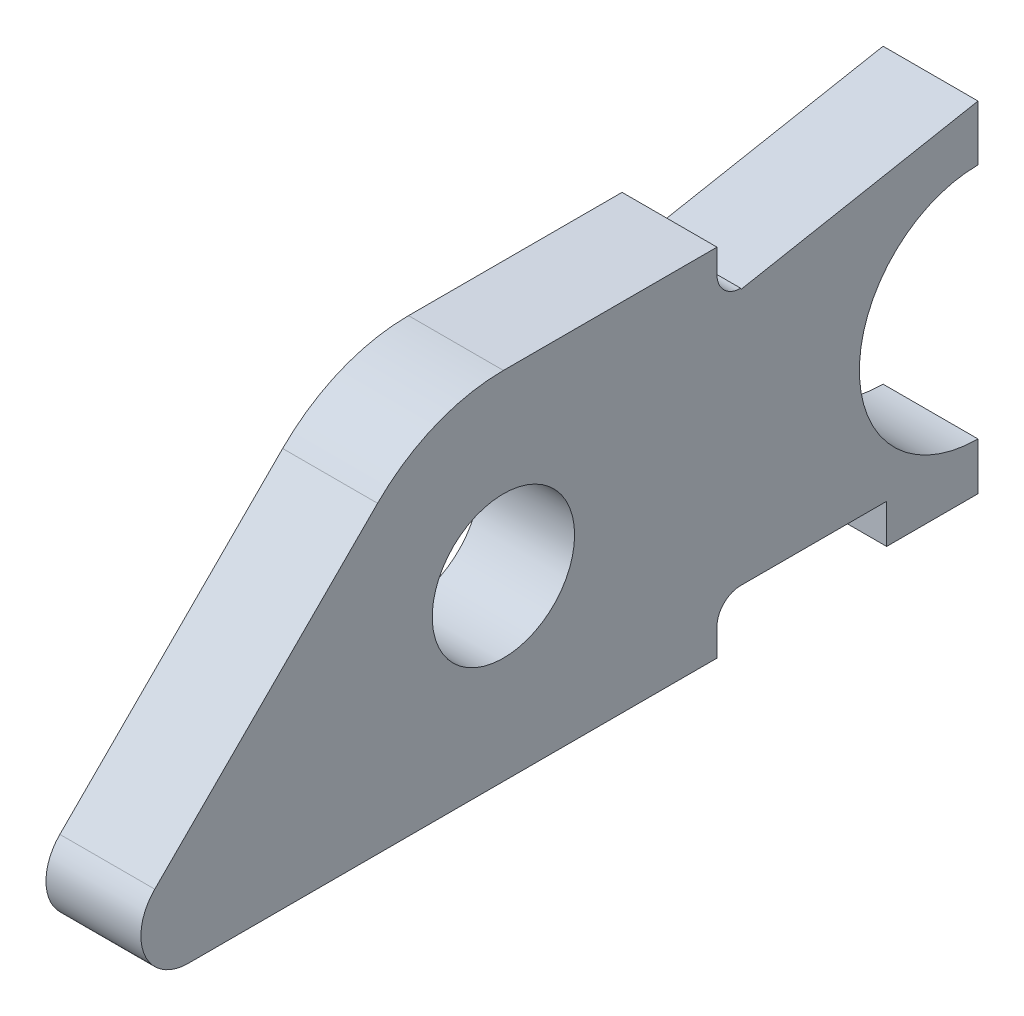
ISO-10303-21;
HEADER;
FILE_DESCRIPTION(('STEP AP214'),'2;1');
FILE_NAME('part.step','',(''),(''),'','','');
FILE_SCHEMA(('AUTOMOTIVE_DESIGN { 1 0 10303 214 1 1 1 1 }'));
ENDSEC;
DATA;
#1=APPLICATION_CONTEXT('core data for automotive mechanical design processes');
#2=APPLICATION_PROTOCOL_DEFINITION('international standard','automotive_design',2000,#1);
#3=PRODUCT_CONTEXT('',#1,'mechanical');
#4=PRODUCT('Part','Part','',(#3));
#5=PRODUCT_RELATED_PRODUCT_CATEGORY('part','',(#4));
#6=PRODUCT_DEFINITION_FORMATION('','',#4);
#7=PRODUCT_DEFINITION_CONTEXT('part definition',#1,'design');
#8=PRODUCT_DEFINITION('design','',#6,#7);
#9=PRODUCT_DEFINITION_SHAPE('','',#8);
#10=(LENGTH_UNIT() NAMED_UNIT(*) SI_UNIT(.MILLI.,.METRE.));
#11=(NAMED_UNIT(*) PLANE_ANGLE_UNIT() SI_UNIT($,.RADIAN.));
#12=(NAMED_UNIT(*) SI_UNIT($,.STERADIAN.) SOLID_ANGLE_UNIT());
#13=UNCERTAINTY_MEASURE_WITH_UNIT(LENGTH_MEASURE(1.E-05),#10,'distance_accuracy_value','');
#14=(GEOMETRIC_REPRESENTATION_CONTEXT(3) GLOBAL_UNCERTAINTY_ASSIGNED_CONTEXT((#13)) GLOBAL_UNIT_ASSIGNED_CONTEXT((#10,
#11,#12)) REPRESENTATION_CONTEXT('',''));
#15=CARTESIAN_POINT('',(0.,0.,0.));
#16=DIRECTION('',(0.,0.,1.));
#17=DIRECTION('',(1.,0.,0.));
#18=AXIS2_PLACEMENT_3D('',#15,#16,#17);
#19=CARTESIAN_POINT('',(-32.4999999999999,4.1,199.425235860835));
#20=DIRECTION('',(0.,0.,-1.));
#21=DIRECTION('',(-1.,0.,0.));
#22=AXIS2_PLACEMENT_3D('',#19,#20,#21);
#23=PLANE('',#22);
#24=DIRECTION('',(-1.,0.,0.));
#25=VECTOR('',#24,1.);
#26=CARTESIAN_POINT('',(-32.4999999999999,1.,199.425235860835));
#27=LINE('',#26,#25);
#28=CARTESIAN_POINT('',(-24.4999999999999,0.999999999999999,199.425235860835));
#29=VERTEX_POINT('',#28);
#30=CARTESIAN_POINT('',(-32.4999999999999,1.,199.425235860835));
#31=VERTEX_POINT('',#30);
#32=EDGE_CURVE('E156',#29,#31,#27,.T.);
#33=ORIENTED_EDGE('',*,*,#32,.F.);
#34=DIRECTION('',(0.,-1.,0.));
#35=VECTOR('',#34,1.);
#36=CARTESIAN_POINT('',(-24.4999999999999,4.1,199.425235860835));
#37=LINE('',#36,#35);
#38=CARTESIAN_POINT('',(-24.4999999999999,4.3,199.425235860835));
#39=VERTEX_POINT('',#38);
#40=EDGE_CURVE('E164',#39,#29,#37,.T.);
#41=ORIENTED_EDGE('',*,*,#40,.F.);
#42=DIRECTION('',(-1.,0.,0.));
#43=VECTOR('',#42,1.);
#44=CARTESIAN_POINT('',(-24.4999999999999,4.3,199.425235860835));
#45=LINE('',#44,#43);
#46=CARTESIAN_POINT('',(-32.4999999999999,4.3,199.425235860835));
#47=VERTEX_POINT('',#46);
#48=EDGE_CURVE('E315',#39,#47,#45,.T.);
#49=ORIENTED_EDGE('',*,*,#48,.T.);
#50=DIRECTION('',(0.,-1.,0.));
#51=VECTOR('',#50,1.);
#52=CARTESIAN_POINT('',(-32.4999999999999,4.1,199.425235860835));
#53=LINE('',#52,#51);
#54=EDGE_CURVE('E166',#47,#31,#53,.T.);
#55=ORIENTED_EDGE('',*,*,#54,.T.);
#56=EDGE_LOOP('',(#33,#41,#49,#55));
#57=FACE_BOUND('',#56,.T.);
#58=ADVANCED_FACE('F33',(#57),#23,.F.);
#59=CARTESIAN_POINT('',(-24.4999999999999,0.,191.725235860835));
#60=DIRECTION('',(0.,0.,1.));
#61=DIRECTION('',(1.,0.,0.));
#62=AXIS2_PLACEMENT_3D('',#59,#60,#61);
#63=PLANE('',#62);
#64=DIRECTION('',(1.,0.,0.));
#65=VECTOR('',#64,1.);
#66=CARTESIAN_POINT('',(-24.4999999999999,1.,191.725235860835));
#67=LINE('',#66,#65);
#68=CARTESIAN_POINT('',(-32.4999999999999,1.,191.725235860835));
#69=VERTEX_POINT('',#68);
#70=CARTESIAN_POINT('',(-24.4999999999999,0.999999999999999,191.725235860835));
#71=VERTEX_POINT('',#70);
#72=EDGE_CURVE('E48',#69,#71,#67,.T.);
#73=ORIENTED_EDGE('',*,*,#72,.F.);
#74=DIRECTION('',(0.,1.,0.));
#75=VECTOR('',#74,1.);
#76=CARTESIAN_POINT('',(-32.4999999999999,0.,191.725235860835));
#77=LINE('',#76,#75);
#78=CARTESIAN_POINT('',(-32.4999999999999,4.99999999999998,191.725235860835));
#79=VERTEX_POINT('',#78);
#80=EDGE_CURVE('E187',#69,#79,#77,.T.);
#81=ORIENTED_EDGE('',*,*,#80,.T.);
#82=DIRECTION('',(-1.,0.,0.));
#83=VECTOR('',#82,1.);
#84=CARTESIAN_POINT('',(-24.4999999999999,4.99999999999998,191.725235860835));
#85=LINE('',#84,#83);
#86=CARTESIAN_POINT('',(-24.4999999999999,4.99999999999998,191.725235860835));
#87=VERTEX_POINT('',#86);
#88=EDGE_CURVE('E235',#87,#79,#85,.T.);
#89=ORIENTED_EDGE('',*,*,#88,.F.);
#90=DIRECTION('',(0.,1.,0.));
#91=VECTOR('',#90,1.);
#92=CARTESIAN_POINT('',(-24.4999999999999,0.,191.725235860835));
#93=LINE('',#92,#91);
#94=EDGE_CURVE('E174',#71,#87,#93,.T.);
#95=ORIENTED_EDGE('',*,*,#94,.F.);
#96=EDGE_LOOP('',(#73,#81,#89,#95));
#97=FACE_BOUND('',#96,.T.);
#98=ADVANCED_FACE('F336',(#97),#63,.F.);
#99=CARTESIAN_POINT('',(-32.4999999999999,15.,231.725235860835));
#100=DIRECTION('',(1.,0.,0.));
#101=DIRECTION('',(0.,0.,-1.));
#102=AXIS2_PLACEMENT_3D('',#99,#100,#101);
#103=PLANE('',#102);
#104=CARTESIAN_POINT('',(-32.4999999999999,15.,231.725235860835));
#105=DIRECTION('',(1.,0.,0.));
#106=DIRECTION('',(0.,0.,-1.));
#107=AXIS2_PLACEMENT_3D('',#104,#105,#106);
#108=CIRCLE('',#107,5.99999999999999);
#109=CARTESIAN_POINT('',(-32.4999999999999,15.,225.725235860835));
#110=VERTEX_POINT('',#109);
#111=EDGE_CURVE('E202',#110,#110,#108,.T.);
#112=ORIENTED_EDGE('',*,*,#111,.T.);
#113=EDGE_LOOP('',(#112));
#114=FACE_BOUND('',#113,.T.);
#115=DIRECTION('',(0.,0.,-1.));
#116=VECTOR('',#115,1.);
#117=CARTESIAN_POINT('',(-32.4999999999999,0.999999999999999,231.725235860835));
#118=LINE('',#117,#116);
#119=EDGE_CURVE('E167',#31,#69,#118,.T.);
#120=ORIENTED_EDGE('',*,*,#119,.F.);
#121=ORIENTED_EDGE('',*,*,#54,.F.);
#122=DIRECTION('',(0.,0.,-1.));
#123=VECTOR('',#122,1.);
#124=CARTESIAN_POINT('',(-32.4999999999999,4.3,211.725235860835));
#125=LINE('',#124,#123);
#126=CARTESIAN_POINT('',(-32.4999999999999,4.3,211.725235860835));
#127=VERTEX_POINT('',#126);
#128=EDGE_CURVE('E325',#127,#47,#125,.T.);
#129=ORIENTED_EDGE('',*,*,#128,.F.);
#130=CARTESIAN_POINT('',(-32.4999999999999,2.3,211.725235860835));
#131=DIRECTION('',(-1.,0.,0.));
#132=DIRECTION('',(0.,0.,-1.));
#133=AXIS2_PLACEMENT_3D('',#130,#131,#132);
#134=CIRCLE('',#133,2.00000000000002);
#135=CARTESIAN_POINT('',(-32.4999999999999,2.3,213.725235860835));
#136=VERTEX_POINT('',#135);
#137=EDGE_CURVE('E55',#136,#127,#134,.T.);
#138=ORIENTED_EDGE('',*,*,#137,.F.);
#139=DIRECTION('',(0.,1.,0.));
#140=VECTOR('',#139,1.);
#141=CARTESIAN_POINT('',(-32.4999999999999,0.,213.725235860835));
#142=LINE('',#141,#140);
#143=CARTESIAN_POINT('',(-32.4999999999999,0.,213.725235860835));
#144=VERTEX_POINT('',#143);
#145=EDGE_CURVE('E321',#144,#136,#142,.T.);
#146=ORIENTED_EDGE('',*,*,#145,.F.);
#147=DIRECTION('',(0.,0.,-1.));
#148=VECTOR('',#147,1.);
#149=CARTESIAN_POINT('',(-32.4999999999999,0.,231.725235860835));
#150=LINE('',#149,#148);
#151=CARTESIAN_POINT('',(-32.4999999999999,0.,258.281585046939));
#152=VERTEX_POINT('',#151);
#153=EDGE_CURVE('E175',#152,#144,#150,.T.);
#154=ORIENTED_EDGE('',*,*,#153,.F.);
#155=CARTESIAN_POINT('',(-32.4999999999999,4.,258.281585046939));
#156=DIRECTION('',(1.,0.,0.));
#157=DIRECTION('',(0.,0.,-1.));
#158=AXIS2_PLACEMENT_3D('',#155,#156,#157);
#159=CIRCLE('',#158,4.);
#160=CARTESIAN_POINT('',(-32.4999999999999,6.82842712474621,261.110012171685));
#161=VERTEX_POINT('',#160);
#162=EDGE_CURVE('E205',#152,#161,#159,.F.);
#163=ORIENTED_EDGE('',*,*,#162,.T.);
#164=DIRECTION('',(0.,-0.707106781186544,0.707106781186551));
#165=VECTOR('',#164,1.);
#166=CARTESIAN_POINT('',(-32.4999999999999,25.6066017177983,242.331837578633));
#167=LINE('',#166,#165);
#168=CARTESIAN_POINT('',(-32.4999999999999,25.6066017177983,242.331837578633));
#169=VERTEX_POINT('',#168);
#170=EDGE_CURVE('E200',#169,#161,#167,.T.);
#171=ORIENTED_EDGE('',*,*,#170,.F.);
#172=CARTESIAN_POINT('',(-32.4999999999999,15.,231.725235860835));
#173=DIRECTION('',(1.,0.,0.));
#174=DIRECTION('',(0.,0.,-1.));
#175=AXIS2_PLACEMENT_3D('',#172,#173,#174);
#176=CIRCLE('',#175,15.);
#177=CARTESIAN_POINT('',(-32.4999999999999,30.,231.725235860835));
#178=VERTEX_POINT('',#177);
#179=EDGE_CURVE('E224',#178,#169,#176,.T.);
#180=ORIENTED_EDGE('',*,*,#179,.F.);
#181=DIRECTION('',(0.,0.,1.));
#182=VECTOR('',#181,1.);
#183=CARTESIAN_POINT('',(-32.4999999999999,30.,231.725235860835));
#184=LINE('',#183,#182);
#185=CARTESIAN_POINT('',(-32.4999999999999,30.,213.725235860835));
#186=VERTEX_POINT('',#185);
#187=EDGE_CURVE('E196',#186,#178,#184,.T.);
#188=ORIENTED_EDGE('',*,*,#187,.F.);
#189=DIRECTION('',(0.,1.,0.));
#190=VECTOR('',#189,1.);
#191=CARTESIAN_POINT('',(-32.4999999999999,31.565435865744,213.725235860835));
#192=LINE('',#191,#190);
#193=CARTESIAN_POINT('',(-32.4999999999999,28.,213.725235860835));
#194=VERTEX_POINT('',#193);
#195=EDGE_CURVE('E192',#194,#186,#192,.T.);
#196=ORIENTED_EDGE('',*,*,#195,.F.);
#197=CARTESIAN_POINT('',(-32.4999999999999,28.,211.725235860835));
#198=DIRECTION('',(-1.,0.,0.));
#199=DIRECTION('',(0.,0.,1.));
#200=AXIS2_PLACEMENT_3D('',#197,#198,#199);
#201=CIRCLE('',#200,2.);
#202=CARTESIAN_POINT('',(-32.4999999999999,26.0000000000001,211.725235860835));
#203=VERTEX_POINT('',#202);
#204=EDGE_CURVE('E259',#203,#194,#201,.T.);
#205=ORIENTED_EDGE('',*,*,#204,.F.);
#206=DIRECTION('',(0.,-0.982717494039836,-0.185111660648554));
#207=VECTOR('',#206,1.);
#208=CARTESIAN_POINT('',(-32.4999999999999,25.9017282505961,211.70672469477));
#209=LINE('',#208,#207);
#210=CARTESIAN_POINT('',(-32.4999999999999,25.9017282505961,211.70672469477));
#211=VERTEX_POINT('',#210);
#212=EDGE_CURVE('E184',#203,#211,#209,.T.);
#213=ORIENTED_EDGE('',*,*,#212,.T.);
#214=DIRECTION('',(0.,-0.185111660648554,0.982717494039836));
#215=VECTOR('',#214,1.);
#216=CARTESIAN_POINT('',(-32.4999999999999,21.8865493092054,233.022435296579));
#217=LINE('',#216,#215);
#218=CARTESIAN_POINT('',(-32.4999999999999,29.6655836848521,191.725235860835));
#219=VERTEX_POINT('',#218);
#220=EDGE_CURVE('E223',#219,#211,#217,.T.);
#221=ORIENTED_EDGE('',*,*,#220,.F.);
#222=DIRECTION('',(0.,1.,0.));
#223=VECTOR('',#222,1.);
#224=CARTESIAN_POINT('',(-32.4999999999999,25.,191.725235860835));
#225=LINE('',#224,#223);
#226=CARTESIAN_POINT('',(-32.4999999999999,25.,191.725235860835));
#227=VERTEX_POINT('',#226);
#228=EDGE_CURVE('E201',#227,#219,#225,.T.);
#229=ORIENTED_EDGE('',*,*,#228,.F.);
#230=CARTESIAN_POINT('',(-32.4999999999999,15.,191.725235860835));
#231=DIRECTION('',(-1.,0.,0.));
#232=DIRECTION('',(0.,0.,-1.));
#233=AXIS2_PLACEMENT_3D('',#230,#231,#232);
#234=CIRCLE('',#233,10.);
#235=CARTESIAN_POINT('',(-32.4999999999999,19.0395107853482,200.873041751596));
#236=VERTEX_POINT('',#235);
#237=EDGE_CURVE('E236',#236,#227,#234,.T.);
#238=ORIENTED_EDGE('',*,*,#237,.F.);
#239=CARTESIAN_POINT('',(-32.4999999999999,23.5880205849026,196.270422640209));
#240=CARTESIAN_POINT('',(-32.4999999999998,23.4627806799361,196.524280578063));
#241=CARTESIAN_POINT('',(-32.4999999999999,23.327413466732,196.773172749248));
#242=CARTESIAN_POINT('',(-32.5,23.037064773655,197.259337250591));
#243=CARTESIAN_POINT('',(-32.5,22.8820774085537,197.496606064484));
#244=CARTESIAN_POINT('',(-32.5,22.5535253653482,197.957231472368));
#245=CARTESIAN_POINT('',(-32.4999999999999,22.3799974813209,198.180614278739));
#246=CARTESIAN_POINT('',(-32.5,22.0150107442371,198.612183696308));
#247=CARTESIAN_POINT('',(-32.5000000000002,21.8235542605115,198.820372309022));
#248=CARTESIAN_POINT('',(-32.5000000000001,21.4305836433543,199.212992416942));
#249=CARTESIAN_POINT('',(-32.4999999999999,21.2296384835285,199.39799333774));
#250=CARTESIAN_POINT('',(-32.4999999999999,20.8130906141114,199.750676516745));
#251=CARTESIAN_POINT('',(-32.5000000000002,20.5974889759031,199.918360038594));
#252=CARTESIAN_POINT('',(-32.5000000000002,20.1597988968674,200.23002840806));
#253=CARTESIAN_POINT('',(-32.4999999999999,19.93811896818,200.374586923488));
#254=CARTESIAN_POINT('',(-32.4999999999999,19.4835617918229,200.644774176933));
#255=CARTESIAN_POINT('',(-32.5000000000001,19.2506870952508,200.770407201026));
#256=CARTESIAN_POINT('',(-32.5000000000001,18.7812974197909,200.998651721197));
#257=CARTESIAN_POINT('',(-32.4999999999999,18.5450297934304,201.101771876188));
#258=CARTESIAN_POINT('',(-32.4999999999999,18.0645639486794,201.288112089247));
#259=CARTESIAN_POINT('',(-32.5,17.8203600284167,201.371317463647));
#260=CARTESIAN_POINT('',(-32.5,17.3268434595834,201.516640815069));
#261=CARTESIAN_POINT('',(-32.4999999999999,17.0775559430749,201.578844084656));
#262=CARTESIAN_POINT('',(-32.4999999999999,16.5745347801363,201.682049985256));
#263=CARTESIAN_POINT('',(-32.4999999999999,16.3207996064935,201.723045180442));
#264=CARTESIAN_POINT('',(-32.4999999999999,15.8104906535878,201.783428624376));
#265=CARTESIAN_POINT('',(-32.4999999999999,15.5539141032364,201.802793477006));
#266=CARTESIAN_POINT('',(-32.4999999999999,15.0400438220801,201.81964221436));
#267=CARTESIAN_POINT('',(-32.4999999999999,14.7827500946299,201.817126201267));
#268=CARTESIAN_POINT('',(-32.4999999999999,14.2704424716439,201.790298402981));
#269=CARTESIAN_POINT('',(-32.4999999999999,14.0154235258876,201.76608286798));
#270=CARTESIAN_POINT('',(-32.4999999999999,13.5083343569649,201.696229221133));
#271=CARTESIAN_POINT('',(-32.4999999999999,13.2562641883198,201.650590713828));
#272=CARTESIAN_POINT('',(-32.4999999999999,12.7569236875041,201.538355919395));
#273=CARTESIAN_POINT('',(-32.4999999999999,12.509651830298,201.471766410857));
#274=CARTESIAN_POINT('',(-32.4999999999999,12.0215058240296,201.318261841289));
#275=CARTESIAN_POINT('',(-32.4999999999999,11.7806316777924,201.231346771285));
#276=CARTESIAN_POINT('',(-32.4999999999999,11.3056725167717,201.037512952859));
#277=CARTESIAN_POINT('',(-32.4999999999999,11.0716274240356,200.930496453516));
#278=CARTESIAN_POINT('',(-32.4999999999999,10.6130637746904,200.697711141833));
#279=CARTESIAN_POINT('',(-32.4999999999999,10.3885452846742,200.571942198438));
#280=CARTESIAN_POINT('',(-32.4999999999999,9.95032361355817,200.3027056593));
#281=CARTESIAN_POINT('',(-32.4999999999999,9.7366228491733,200.159234133138));
#282=CARTESIAN_POINT('',(-32.4999999999999,9.32119430288719,199.85572581663));
#283=CARTESIAN_POINT('',(-32.4999999999999,9.11947193380307,199.695681625693));
#284=CARTESIAN_POINT('',(-32.4999999999999,8.72045719368244,199.352850336421));
#285=CARTESIAN_POINT('',(-32.4999999999999,8.52376231392411,199.169367766517));
#286=CARTESIAN_POINT('',(-32.4999999999999,8.14581052120411,198.78728626786));
#287=CARTESIAN_POINT('',(-32.4999999999999,7.96454795558277,198.588692924904));
#288=CARTESIAN_POINT('',(-32.4999999999999,7.61839129220552,198.17798502788));
#289=CARTESIAN_POINT('',(-32.4999999999998,7.45348540844782,197.965880393199));
#290=CARTESIAN_POINT('',(-32.5,7.14068637544232,197.529593850858));
#291=CARTESIAN_POINT('',(-32.5000000000003,6.99278609050363,197.305417067181));
#292=CARTESIAN_POINT('',(-32.5000000000002,6.7742132609431,196.944865251824));
#293=CARTESIAN_POINT('',(-32.5,6.69761272172965,196.812045176091));
#294=CARTESIAN_POINT('',(-32.4999999999998,6.55036114834705,196.543442362669));
#295=CARTESIAN_POINT('',(-32.4999999999998,6.47970015099404,196.407665087633));
#296=CARTESIAN_POINT('',(-32.4999999999999,6.41197941509741,196.270422640209));
#297=B_SPLINE_CURVE_WITH_KNOTS('',3,(#239,#240,#241,#242,#243,#244,#245,#246,#247,#248,#249,
#250,#251,#252,#253,#254,#255,#256,#257,#258,#259,#260,#261,#262,#263,#264,#265,#266,#267,#268,
#269,#270,#271,#272,#273,#274,#275,#276,#277,#278,#279,#280,#281,#282,#283,#284,#285,#286,#287,
#288,#289,#290,#291,#292,#293,#294,#295,#296),.UNSPECIFIED.,.F.,.F.,(4,2,2,2,2,2,2,2,2,2,2,2,2,
2,2,2,2,2,2,2,2,2,2,2,2,2,2,2,4),(0.,0.849030208399633,1.6983156966396,2.54594600899069,
3.39346446151166,4.2119587470437,5.03039326514864,5.82344691215661,6.61632068456277,
7.38881831905712,8.16188379277924,8.9317708733114,9.7019277036108,10.4729167576343,
11.2439022111803,12.0114847245759,12.779081407809,13.5464299939909,14.3137789190176,
15.0849607952938,15.8561480613873,16.6275068596703,17.3992116090843,18.2052880876718,
19.0110680289382,19.8162630723666,20.6211190066299,21.0809676594302,21.5400288780514),.UNSPECIFIED.);
#298=CARTESIAN_POINT('',(-32.4999999999999,10.9604892146517,200.873041751596));
#299=VERTEX_POINT('',#298);
#300=EDGE_CURVE('E274',#236,#299,#297,.T.);
#301=ORIENTED_EDGE('',*,*,#300,.T.);
#302=EDGE_CURVE('E232',#79,#299,#234,.T.);
#303=ORIENTED_EDGE('',*,*,#302,.F.);
#304=ORIENTED_EDGE('',*,*,#80,.F.);
#305=EDGE_LOOP('',(#120,#121,#129,#138,#146,#154,#163,#171,#180,#188,#196,#205,#213,#221,#229,
#238,#301,#303,#304));
#306=FACE_BOUND('',#305,.T.);
#307=ADVANCED_FACE('F295',(#114,#306),#103,.F.);
#308=CARTESIAN_POINT('',(-24.4999999999999,15.,231.725235860835));
#309=DIRECTION('',(1.,0.,0.));
#310=DIRECTION('',(0.,0.,-1.));
#311=AXIS2_PLACEMENT_3D('',#308,#309,#310);
#312=PLANE('',#311);
#313=CARTESIAN_POINT('',(-24.4999999999999,15.,231.725235860835));
#314=DIRECTION('',(1.,0.,0.));
#315=DIRECTION('',(0.,0.,-1.));
#316=AXIS2_PLACEMENT_3D('',#313,#314,#315);
#317=CIRCLE('',#316,5.99999999999999);
#318=CARTESIAN_POINT('',(-24.4999999999999,15.,225.725235860835));
#319=VERTEX_POINT('',#318);
#320=EDGE_CURVE('E197',#319,#319,#317,.T.);
#321=ORIENTED_EDGE('',*,*,#320,.F.);
#322=EDGE_LOOP('',(#321));
#323=FACE_BOUND('',#322,.T.);
#324=ORIENTED_EDGE('',*,*,#40,.T.);
#325=DIRECTION('',(0.,0.,-1.));
#326=VECTOR('',#325,1.);
#327=CARTESIAN_POINT('',(-24.4999999999999,0.999999999999999,231.725235860835));
#328=LINE('',#327,#326);
#329=EDGE_CURVE('E11',#29,#71,#328,.T.);
#330=ORIENTED_EDGE('',*,*,#329,.T.);
#331=ORIENTED_EDGE('',*,*,#94,.T.);
#332=CARTESIAN_POINT('',(-24.4999999999999,15.,191.725235860835));
#333=DIRECTION('',(-1.,0.,0.));
#334=DIRECTION('',(0.,0.,-1.));
#335=AXIS2_PLACEMENT_3D('',#332,#333,#334);
#336=CIRCLE('',#335,10.);
#337=CARTESIAN_POINT('',(-24.4999999999999,25.,191.725235860835));
#338=VERTEX_POINT('',#337);
#339=EDGE_CURVE('E177',#87,#338,#336,.T.);
#340=ORIENTED_EDGE('',*,*,#339,.T.);
#341=DIRECTION('',(0.,1.,0.));
#342=VECTOR('',#341,1.);
#343=CARTESIAN_POINT('',(-24.4999999999999,25.,191.725235860835));
#344=LINE('',#343,#342);
#345=CARTESIAN_POINT('',(-24.4999999999999,29.6655836848521,191.725235860835));
#346=VERTEX_POINT('',#345);
#347=EDGE_CURVE('E206',#338,#346,#344,.T.);
#348=ORIENTED_EDGE('',*,*,#347,.T.);
#349=DIRECTION('',(0.,0.185111660648554,-0.982717494039836));
#350=VECTOR('',#349,1.);
#351=CARTESIAN_POINT('',(-24.4999999999999,35.6903819791565,159.740893755476));
#352=LINE('',#351,#350);
#353=CARTESIAN_POINT('',(-24.4999999999999,25.9017282505961,211.70672469477));
#354=VERTEX_POINT('',#353);
#355=EDGE_CURVE('E263',#354,#346,#352,.T.);
#356=ORIENTED_EDGE('',*,*,#355,.F.);
#357=DIRECTION('',(0.,0.982717494039836,0.185111660648554));
#358=VECTOR('',#357,1.);
#359=CARTESIAN_POINT('',(-24.4999999999999,25.9017282505961,211.70672469477));
#360=LINE('',#359,#358);
#361=CARTESIAN_POINT('',(-24.4999999999999,26.,211.725235860835));
#362=VERTEX_POINT('',#361);
#363=EDGE_CURVE('E41',#354,#362,#360,.T.);
#364=ORIENTED_EDGE('',*,*,#363,.T.);
#365=CARTESIAN_POINT('',(-24.4999999999999,28.,211.725235860835));
#366=DIRECTION('',(1.,0.,0.));
#367=DIRECTION('',(0.,0.,-1.));
#368=AXIS2_PLACEMENT_3D('',#365,#366,#367);
#369=CIRCLE('',#368,2.);
#370=CARTESIAN_POINT('',(-24.4999999999999,28.,213.725235860835));
#371=VERTEX_POINT('',#370);
#372=EDGE_CURVE('E188',#371,#362,#369,.T.);
#373=ORIENTED_EDGE('',*,*,#372,.F.);
#374=DIRECTION('',(0.,-1.,0.));
#375=VECTOR('',#374,1.);
#376=CARTESIAN_POINT('',(-24.4999999999999,15.,213.725235860835));
#377=LINE('',#376,#375);
#378=CARTESIAN_POINT('',(-24.4999999999999,30.,213.725235860835));
#379=VERTEX_POINT('',#378);
#380=EDGE_CURVE('E193',#379,#371,#377,.T.);
#381=ORIENTED_EDGE('',*,*,#380,.F.);
#382=DIRECTION('',(0.,0.,1.));
#383=VECTOR('',#382,1.);
#384=CARTESIAN_POINT('',(-24.4999999999999,30.,231.725235860835));
#385=LINE('',#384,#383);
#386=CARTESIAN_POINT('',(-24.4999999999999,30.,231.725235860835));
#387=VERTEX_POINT('',#386);
#388=EDGE_CURVE('E211',#379,#387,#385,.T.);
#389=ORIENTED_EDGE('',*,*,#388,.T.);
#390=CARTESIAN_POINT('',(-24.4999999999999,15.,231.725235860835));
#391=DIRECTION('',(1.,0.,0.));
#392=DIRECTION('',(0.,0.,-1.));
#393=AXIS2_PLACEMENT_3D('',#390,#391,#392);
#394=CIRCLE('',#393,15.);
#395=CARTESIAN_POINT('',(-24.4999999999999,25.6066017177983,242.331837578633));
#396=VERTEX_POINT('',#395);
#397=EDGE_CURVE('E207',#387,#396,#394,.T.);
#398=ORIENTED_EDGE('',*,*,#397,.T.);
#399=DIRECTION('',(0.,-0.707106781186544,0.707106781186551));
#400=VECTOR('',#399,1.);
#401=CARTESIAN_POINT('',(-24.4999999999999,25.6066017177983,242.331837578633));
#402=LINE('',#401,#400);
#403=CARTESIAN_POINT('',(-24.4999999999999,6.82842712474621,261.110012171685));
#404=VERTEX_POINT('',#403);
#405=EDGE_CURVE('E210',#396,#404,#402,.T.);
#406=ORIENTED_EDGE('',*,*,#405,.T.);
#407=CARTESIAN_POINT('',(-24.4999999999999,4.,258.281585046939));
#408=DIRECTION('',(1.,0.,0.));
#409=DIRECTION('',(0.,0.,-1.));
#410=AXIS2_PLACEMENT_3D('',#407,#408,#409);
#411=CIRCLE('',#410,4.);
#412=CARTESIAN_POINT('',(-24.4999999999999,0.,258.281585046939));
#413=VERTEX_POINT('',#412);
#414=EDGE_CURVE('E214',#404,#413,#411,.T.);
#415=ORIENTED_EDGE('',*,*,#414,.T.);
#416=DIRECTION('',(0.,0.,-1.));
#417=VECTOR('',#416,1.);
#418=CARTESIAN_POINT('',(-24.4999999999999,0.,267.938439296431));
#419=LINE('',#418,#417);
#420=CARTESIAN_POINT('',(-24.4999999999999,0.,213.725235860835));
#421=VERTEX_POINT('',#420);
#422=EDGE_CURVE('E215',#413,#421,#419,.T.);
#423=ORIENTED_EDGE('',*,*,#422,.T.);
#424=DIRECTION('',(0.,1.,0.));
#425=VECTOR('',#424,1.);
#426=CARTESIAN_POINT('',(-24.4999999999999,0.,213.725235860835));
#427=LINE('',#426,#425);
#428=CARTESIAN_POINT('',(-24.4999999999999,2.3,213.725235860835));
#429=VERTEX_POINT('',#428);
#430=EDGE_CURVE('E316',#421,#429,#427,.T.);
#431=ORIENTED_EDGE('',*,*,#430,.T.);
#432=CARTESIAN_POINT('',(-24.4999999999999,2.3,211.725235860835));
#433=DIRECTION('',(-1.,0.,0.));
#434=DIRECTION('',(0.,0.,-1.));
#435=AXIS2_PLACEMENT_3D('',#432,#433,#434);
#436=CIRCLE('',#435,2.00000000000002);
#437=CARTESIAN_POINT('',(-24.4999999999999,4.3,211.725235860835));
#438=VERTEX_POINT('',#437);
#439=EDGE_CURVE('E324',#429,#438,#436,.T.);
#440=ORIENTED_EDGE('',*,*,#439,.T.);
#441=DIRECTION('',(0.,0.,-1.));
#442=VECTOR('',#441,1.);
#443=CARTESIAN_POINT('',(-24.4999999999999,4.3,211.725235860835));
#444=LINE('',#443,#442);
#445=EDGE_CURVE('E173',#438,#39,#444,.T.);
#446=ORIENTED_EDGE('',*,*,#445,.T.);
#447=EDGE_LOOP('',(#324,#330,#331,#340,#348,#356,#364,#373,#381,#389,#398,#406,#415,#423,#431,
#440,#446));
#448=FACE_BOUND('',#447,.T.);
#449=ADVANCED_FACE('F170',(#323,#448),#312,.T.);
#450=CARTESIAN_POINT('',(-41.4452857372946,15.,193.795788221655));
#451=DIRECTION('',(0.965925826289068,0.,-0.258819045102523));
#452=DIRECTION('',(0.258819045102523,0.,0.965925826289068));
#453=AXIS2_PLACEMENT_3D('',#450,#451,#452);
#454=ELLIPSE('',#453,10.0622224879759,9.71586042675724);
#455=DIRECTION('',(0.965925826289068,0.,-0.258819045102523));
#456=VECTOR('',#455,1.);
#457=SURFACE_OF_LINEAR_EXTRUSION('',#454,#456);
#458=CARTESIAN_POINT('',(-32.4999999999999,10.9604892146517,200.873041751596));
#459=CARTESIAN_POINT('',(-32.4712660385727,11.1190368712364,200.943061989833));
#460=CARTESIAN_POINT('',(-32.4444051819133,11.2796958888966,201.00907227986));
#461=CARTESIAN_POINT('',(-32.3943830425595,11.6047436330817,201.132809208907));
#462=CARTESIAN_POINT('',(-32.3712219000006,11.7691325006145,201.190535534141));
#463=CARTESIAN_POINT('',(-32.3285545202914,12.1011364218121,201.297435942402));
#464=CARTESIAN_POINT('',(-32.3090483177999,12.2687515060536,201.346609944328));
#465=CARTESIAN_POINT('',(-32.2736724798883,12.6065884671843,201.436162717317));
#466=CARTESIAN_POINT('',(-32.257800761971,12.7768087913608,201.476546524352));
#467=CARTESIAN_POINT('',(-32.2296593854641,13.1194161692867,201.548373604021));
#468=CARTESIAN_POINT('',(-32.2173895889575,13.2918031398119,201.579817218971));
#469=CARTESIAN_POINT('',(-32.1964385171075,13.6381883025154,201.633626127816));
#470=CARTESIAN_POINT('',(-32.1877571340675,13.8121864461785,201.655991694164));
#471=CARTESIAN_POINT('',(-32.1705175114867,14.2488071453826,201.700458140658));
#472=CARTESIAN_POINT('',(-32.1642027475417,14.5121301427387,201.716805578306));
#473=CARTESIAN_POINT('',(-32.1596310723161,15.0393245889263,201.728635689499));
#474=CARTESIAN_POINT('',(-32.1613752781958,15.3031961087277,201.724115470301));
#475=CARTESIAN_POINT('',(-32.1729220693963,15.8293668781489,201.694263031382));
#476=CARTESIAN_POINT('',(-32.182717665857,16.0916672927069,201.668948861476));
#477=CARTESIAN_POINT('',(-32.2103704084416,16.6129360147535,201.597807096385));
#478=CARTESIAN_POINT('',(-32.2282254963763,16.8719051556096,201.551984738495));
#479=CARTESIAN_POINT('',(-32.2782932910513,17.4578944219318,201.424325111378));
#480=CARTESIAN_POINT('',(-32.3131459507507,17.7833063563709,201.335949512245));
#481=CARTESIAN_POINT('',(-32.3755548539298,18.2620059525899,201.179733755342));
#482=CARTESIAN_POINT('',(-32.3980366803246,18.4199501267699,201.123743067024));
#483=CARTESIAN_POINT('',(-32.4464321156096,18.7324053970318,201.004089561797));
#484=CARTESIAN_POINT('',(-32.4723464023276,18.8869158079724,200.940425229753));
#485=CARTESIAN_POINT('',(-32.4999999999998,19.0395107853482,200.873041751596));
#486=B_SPLINE_CURVE_WITH_KNOTS('',3,(#458,#459,#460,#461,#462,#463,#464,#465,#466,#467,#468,
#469,#470,#471,#472,#473,#474,#475,#476,#477,#478,#479,#480,#481,#482,#483,#484,#485),
.UNSPECIFIED.,.F.,.F.,(4,2,2,2,2,2,2,2,2,2,2,2,2,4),(0.,0.526993486697919,1.05400692982296,
1.58102537023691,2.10774107832365,2.6344366159288,3.1611163450408,3.95182644155345,
4.74264615212451,5.53278013038796,6.32271244260066,7.33745686593777,7.8444808591945,
8.3516051271382),.UNSPECIFIED.);
#487=EDGE_CURVE('E279',#299,#236,#486,.T.);
#488=ORIENTED_EDGE('',*,*,#487,.F.);
#489=ORIENTED_EDGE('',*,*,#300,.F.);
#490=EDGE_LOOP('',(#488,#489));
#491=FACE_BOUND('',#490,.T.);
#492=ADVANCED_FACE('F299',(#491),#457,.F.);
#493=CARTESIAN_POINT('',(-24.4999999999999,15.,191.725235860835));
#494=DIRECTION('',(-1.,0.,0.));
#495=DIRECTION('',(0.,0.,1.));
#496=AXIS2_PLACEMENT_3D('',#493,#494,#495);
#497=CYLINDRICAL_SURFACE('',#496,10.);
#498=ORIENTED_EDGE('',*,*,#302,.T.);
#499=ORIENTED_EDGE('',*,*,#487,.T.);
#500=ORIENTED_EDGE('',*,*,#237,.T.);
#501=DIRECTION('',(-1.,0.,0.));
#502=VECTOR('',#501,1.);
#503=CARTESIAN_POINT('',(-24.4999999999999,25.,191.725235860835));
#504=LINE('',#503,#502);
#505=EDGE_CURVE('E218',#338,#227,#504,.T.);
#506=ORIENTED_EDGE('',*,*,#505,.F.);
#507=ORIENTED_EDGE('',*,*,#339,.F.);
#508=ORIENTED_EDGE('',*,*,#88,.T.);
#509=EDGE_LOOP('',(#498,#499,#500,#506,#507,#508));
#510=FACE_BOUND('',#509,.T.);
#511=ADVANCED_FACE('F304',(#510),#497,.F.);
#512=CARTESIAN_POINT('',(-24.4999999999999,25.,191.725235860835));
#513=DIRECTION('',(0.,0.,1.));
#514=DIRECTION('',(1.,0.,0.));
#515=AXIS2_PLACEMENT_3D('',#512,#513,#514);
#516=PLANE('',#515);
#517=DIRECTION('',(-1.,0.,0.));
#518=VECTOR('',#517,1.);
#519=CARTESIAN_POINT('',(-24.4999999999999,29.6655836848521,191.725235860835));
#520=LINE('',#519,#518);
#521=EDGE_CURVE('E261',#346,#219,#520,.T.);
#522=ORIENTED_EDGE('',*,*,#521,.F.);
#523=ORIENTED_EDGE('',*,*,#347,.F.);
#524=ORIENTED_EDGE('',*,*,#505,.T.);
#525=ORIENTED_EDGE('',*,*,#228,.T.);
#526=EDGE_LOOP('',(#522,#523,#524,#525));
#527=FACE_BOUND('',#526,.T.);
#528=ADVANCED_FACE('F345',(#527),#516,.F.);
#529=CARTESIAN_POINT('',(-99.9943656155855,35.6903819791565,159.740893755476));
#530=DIRECTION('',(0.,0.982717494039836,0.185111660648554));
#531=DIRECTION('',(0.,-0.185111660648554,0.982717494039836));
#532=AXIS2_PLACEMENT_3D('',#529,#530,#531);
#533=PLANE('',#532);
#534=ORIENTED_EDGE('',*,*,#220,.T.);
#535=DIRECTION('',(1.,0.,0.));
#536=VECTOR('',#535,1.);
#537=CARTESIAN_POINT('',(-33.8122932351473,25.9017282505961,211.70672469477));
#538=LINE('',#537,#536);
#539=EDGE_CURVE('E269',#211,#354,#538,.T.);
#540=ORIENTED_EDGE('',*,*,#539,.T.);
#541=ORIENTED_EDGE('',*,*,#355,.T.);
#542=ORIENTED_EDGE('',*,*,#521,.T.);
#543=EDGE_LOOP('',(#534,#540,#541,#542));
#544=FACE_BOUND('',#543,.T.);
#545=ADVANCED_FACE('F35',(#544),#533,.T.);
#546=CARTESIAN_POINT('',(-33.8122932351473,25.9017282505961,211.70672469477));
#547=DIRECTION('',(0.,-0.185111660648554,0.982717494039836));
#548=DIRECTION('',(0.,-0.982717494039836,-0.185111660648554));
#549=AXIS2_PLACEMENT_3D('',#546,#547,#548);
#550=PLANE('',#549);
#551=ORIENTED_EDGE('',*,*,#212,.F.);
#552=DIRECTION('',(-1.,0.,0.));
#553=VECTOR('',#552,1.);
#554=CARTESIAN_POINT('',(-23.6999999999999,26.,211.725235860835));
#555=LINE('',#554,#553);
#556=EDGE_CURVE('E191',#362,#203,#555,.T.);
#557=ORIENTED_EDGE('',*,*,#556,.F.);
#558=ORIENTED_EDGE('',*,*,#363,.F.);
#559=ORIENTED_EDGE('',*,*,#539,.F.);
#560=EDGE_LOOP('',(#551,#557,#558,#559));
#561=FACE_BOUND('',#560,.T.);
#562=ADVANCED_FACE('F348',(#561),#550,.F.);
#563=CARTESIAN_POINT('',(-23.6999999999999,28.,211.725235860835));
#564=DIRECTION('',(-1.,0.,0.));
#565=DIRECTION('',(0.,0.,1.));
#566=AXIS2_PLACEMENT_3D('',#563,#564,#565);
#567=CYLINDRICAL_SURFACE('',#566,2.);
#568=ORIENTED_EDGE('',*,*,#372,.T.);
#569=ORIENTED_EDGE('',*,*,#556,.T.);
#570=ORIENTED_EDGE('',*,*,#204,.T.);
#571=DIRECTION('',(-1.,0.,0.));
#572=VECTOR('',#571,1.);
#573=CARTESIAN_POINT('',(-23.6999999999999,28.,213.725235860835));
#574=LINE('',#573,#572);
#575=EDGE_CURVE('E195',#371,#194,#574,.T.);
#576=ORIENTED_EDGE('',*,*,#575,.F.);
#577=EDGE_LOOP('',(#568,#569,#570,#576));
#578=FACE_BOUND('',#577,.T.);
#579=ADVANCED_FACE('F353',(#578),#567,.F.);
#580=CARTESIAN_POINT('',(-23.6999999999999,31.565435865744,213.725235860835));
#581=DIRECTION('',(0.,0.,1.));
#582=DIRECTION('',(1.,0.,0.));
#583=AXIS2_PLACEMENT_3D('',#580,#581,#582);
#584=PLANE('',#583);
#585=ORIENTED_EDGE('',*,*,#380,.T.);
#586=ORIENTED_EDGE('',*,*,#575,.T.);
#587=ORIENTED_EDGE('',*,*,#195,.T.);
#588=DIRECTION('',(-1.,0.,0.));
#589=VECTOR('',#588,1.);
#590=CARTESIAN_POINT('',(-24.4999999999999,30.,213.725235860835));
#591=LINE('',#590,#589);
#592=EDGE_CURVE('E240',#379,#186,#591,.T.);
#593=ORIENTED_EDGE('',*,*,#592,.F.);
#594=EDGE_LOOP('',(#585,#586,#587,#593));
#595=FACE_BOUND('',#594,.T.);
#596=ADVANCED_FACE('F387',(#595),#584,.F.);
#597=CARTESIAN_POINT('',(-24.4999999999999,30.,231.725235860835));
#598=DIRECTION('',(0.,-1.,0.));
#599=DIRECTION('',(0.,0.,-1.));
#600=AXIS2_PLACEMENT_3D('',#597,#598,#599);
#601=PLANE('',#600);
#602=ORIENTED_EDGE('',*,*,#388,.F.);
#603=ORIENTED_EDGE('',*,*,#592,.T.);
#604=ORIENTED_EDGE('',*,*,#187,.T.);
#605=DIRECTION('',(-1.,0.,0.));
#606=VECTOR('',#605,1.);
#607=CARTESIAN_POINT('',(-24.4999999999999,30.,231.725235860835));
#608=LINE('',#607,#606);
#609=EDGE_CURVE('E227',#387,#178,#608,.T.);
#610=ORIENTED_EDGE('',*,*,#609,.F.);
#611=EDGE_LOOP('',(#602,#603,#604,#610));
#612=FACE_BOUND('',#611,.T.);
#613=ADVANCED_FACE('F390',(#612),#601,.F.);
#614=CARTESIAN_POINT('',(-24.4999999999999,15.,231.725235860835));
#615=DIRECTION('',(-1.,0.,0.));
#616=DIRECTION('',(0.,0.,1.));
#617=AXIS2_PLACEMENT_3D('',#614,#615,#616);
#618=CYLINDRICAL_SURFACE('',#617,15.);
#619=ORIENTED_EDGE('',*,*,#179,.T.);
#620=DIRECTION('',(-1.,0.,0.));
#621=VECTOR('',#620,1.);
#622=CARTESIAN_POINT('',(-24.4999999999999,25.6066017177983,242.331837578633));
#623=LINE('',#622,#621);
#624=EDGE_CURVE('E228',#396,#169,#623,.T.);
#625=ORIENTED_EDGE('',*,*,#624,.F.);
#626=ORIENTED_EDGE('',*,*,#397,.F.);
#627=ORIENTED_EDGE('',*,*,#609,.T.);
#628=EDGE_LOOP('',(#619,#625,#626,#627));
#629=FACE_BOUND('',#628,.T.);
#630=ADVANCED_FACE('F395',(#629),#618,.T.);
#631=CARTESIAN_POINT('',(-24.4999999999999,25.6066017177983,242.331837578633));
#632=DIRECTION('',(0.,-0.707106781186551,-0.707106781186544));
#633=DIRECTION('',(0.,0.707106781186544,-0.707106781186551));
#634=AXIS2_PLACEMENT_3D('',#631,#632,#633);
#635=PLANE('',#634);
#636=ORIENTED_EDGE('',*,*,#170,.T.);
#637=DIRECTION('',(-1.,0.,0.));
#638=VECTOR('',#637,1.);
#639=CARTESIAN_POINT('',(-24.4999999999999,6.82842712474621,261.110012171685));
#640=LINE('',#639,#638);
#641=EDGE_CURVE('E230',#161,#404,#640,.F.);
#642=ORIENTED_EDGE('',*,*,#641,.T.);
#643=ORIENTED_EDGE('',*,*,#405,.F.);
#644=ORIENTED_EDGE('',*,*,#624,.T.);
#645=EDGE_LOOP('',(#636,#642,#643,#644));
#646=FACE_BOUND('',#645,.T.);
#647=ADVANCED_FACE('F371',(#646),#635,.F.);
#648=CARTESIAN_POINT('',(0.,4.,258.281585046939));
#649=DIRECTION('',(-1.,0.,0.));
#650=DIRECTION('',(0.,0.,1.));
#651=AXIS2_PLACEMENT_3D('',#648,#649,#650);
#652=CYLINDRICAL_SURFACE('',#651,4.);
#653=ORIENTED_EDGE('',*,*,#414,.F.);
#654=ORIENTED_EDGE('',*,*,#641,.F.);
#655=ORIENTED_EDGE('',*,*,#162,.F.);
#656=DIRECTION('',(-1.,0.,0.));
#657=VECTOR('',#656,1.);
#658=CARTESIAN_POINT('',(0.,0.,258.281585046939));
#659=LINE('',#658,#657);
#660=EDGE_CURVE('E180',#413,#152,#659,.T.);
#661=ORIENTED_EDGE('',*,*,#660,.F.);
#662=EDGE_LOOP('',(#653,#654,#655,#661));
#663=FACE_BOUND('',#662,.T.);
#664=ADVANCED_FACE('F363',(#663),#652,.T.);
#665=CARTESIAN_POINT('',(-24.4999999999999,15.,231.725235860835));
#666=DIRECTION('',(-1.,0.,0.));
#667=DIRECTION('',(0.,0.,1.));
#668=AXIS2_PLACEMENT_3D('',#665,#666,#667);
#669=CYLINDRICAL_SURFACE('',#668,5.99999999999999);
#670=ORIENTED_EDGE('',*,*,#320,.T.);
#671=EDGE_LOOP('',(#670));
#672=FACE_BOUND('',#671,.T.);
#673=ORIENTED_EDGE('',*,*,#111,.F.);
#674=EDGE_LOOP('',(#673));
#675=FACE_BOUND('',#674,.T.);
#676=ADVANCED_FACE('F361',(#672,#675),#669,.F.);
#677=CARTESIAN_POINT('',(0.,0.,52.783119399867));
#678=DIRECTION('',(0.,1.,0.));
#679=DIRECTION('',(0.,0.,1.));
#680=AXIS2_PLACEMENT_3D('',#677,#678,#679);
#681=PLANE('',#680);
#682=ORIENTED_EDGE('',*,*,#153,.T.);
#683=DIRECTION('',(-1.,0.,0.));
#684=VECTOR('',#683,1.);
#685=CARTESIAN_POINT('',(-24.4999999999999,0.,213.725235860835));
#686=LINE('',#685,#684);
#687=EDGE_CURVE('E318',#421,#144,#686,.T.);
#688=ORIENTED_EDGE('',*,*,#687,.F.);
#689=ORIENTED_EDGE('',*,*,#422,.F.);
#690=ORIENTED_EDGE('',*,*,#660,.T.);
#691=EDGE_LOOP('',(#682,#688,#689,#690));
#692=FACE_BOUND('',#691,.T.);
#693=ADVANCED_FACE('F308',(#692),#681,.F.);
#694=CARTESIAN_POINT('',(-24.4999999999999,4.3,211.725235860835));
#695=DIRECTION('',(0.,1.,0.));
#696=DIRECTION('',(0.,0.,1.));
#697=AXIS2_PLACEMENT_3D('',#694,#695,#696);
#698=PLANE('',#697);
#699=ORIENTED_EDGE('',*,*,#128,.T.);
#700=ORIENTED_EDGE('',*,*,#48,.F.);
#701=ORIENTED_EDGE('',*,*,#445,.F.);
#702=DIRECTION('',(-1.,0.,0.));
#703=VECTOR('',#702,1.);
#704=CARTESIAN_POINT('',(-24.4999999999999,4.3,211.725235860835));
#705=LINE('',#704,#703);
#706=EDGE_CURVE('E313',#438,#127,#705,.T.);
#707=ORIENTED_EDGE('',*,*,#706,.T.);
#708=EDGE_LOOP('',(#699,#700,#701,#707));
#709=FACE_BOUND('',#708,.T.);
#710=ADVANCED_FACE('F369',(#709),#698,.F.);
#711=CARTESIAN_POINT('',(-24.4999999999999,0.,213.725235860835));
#712=DIRECTION('',(0.,0.,1.));
#713=DIRECTION('',(0.,-1.,0.));
#714=AXIS2_PLACEMENT_3D('',#711,#712,#713);
#715=PLANE('',#714);
#716=ORIENTED_EDGE('',*,*,#145,.T.);
#717=DIRECTION('',(-1.,0.,0.));
#718=VECTOR('',#717,1.);
#719=CARTESIAN_POINT('',(-24.4999999999999,2.3,213.725235860835));
#720=LINE('',#719,#718);
#721=EDGE_CURVE('E283',#429,#136,#720,.T.);
#722=ORIENTED_EDGE('',*,*,#721,.F.);
#723=ORIENTED_EDGE('',*,*,#430,.F.);
#724=ORIENTED_EDGE('',*,*,#687,.T.);
#725=EDGE_LOOP('',(#716,#722,#723,#724));
#726=FACE_BOUND('',#725,.T.);
#727=ADVANCED_FACE('F427',(#726),#715,.F.);
#728=CARTESIAN_POINT('',(-24.4999999999999,2.3,211.725235860835));
#729=DIRECTION('',(-1.,0.,0.));
#730=DIRECTION('',(0.,0.,1.));
#731=AXIS2_PLACEMENT_3D('',#728,#729,#730);
#732=CYLINDRICAL_SURFACE('',#731,2.00000000000002);
#733=ORIENTED_EDGE('',*,*,#137,.T.);
#734=ORIENTED_EDGE('',*,*,#706,.F.);
#735=ORIENTED_EDGE('',*,*,#439,.F.);
#736=ORIENTED_EDGE('',*,*,#721,.T.);
#737=EDGE_LOOP('',(#733,#734,#735,#736));
#738=FACE_BOUND('',#737,.T.);
#739=ADVANCED_FACE('F306',(#738),#732,.F.);
#740=CARTESIAN_POINT('',(0.,1.,0.));
#741=DIRECTION('',(0.,-1.,0.));
#742=DIRECTION('',(0.,0.,-1.));
#743=AXIS2_PLACEMENT_3D('',#740,#741,#742);
#744=PLANE('',#743);
#745=ORIENTED_EDGE('',*,*,#119,.T.);
#746=ORIENTED_EDGE('',*,*,#72,.T.);
#747=ORIENTED_EDGE('',*,*,#329,.F.);
#748=ORIENTED_EDGE('',*,*,#32,.T.);
#749=EDGE_LOOP('',(#745,#746,#747,#748));
#750=FACE_BOUND('',#749,.T.);
#751=ADVANCED_FACE('F155',(#750),#744,.T.);
#752=CLOSED_SHELL('',(#58,#98,#307,#449,#492,#511,#528,#545,#562,#579,#596,#613,#630,#647,#664,
#676,#693,#710,#727,#739,#751));
#753=MANIFOLD_SOLID_BREP('B2',#752);
#754=ADVANCED_BREP_SHAPE_REPRESENTATION('',(#18,#753),#14);
#755=SHAPE_DEFINITION_REPRESENTATION(#9,#754);
ENDSEC;
END-ISO-10303-21;
